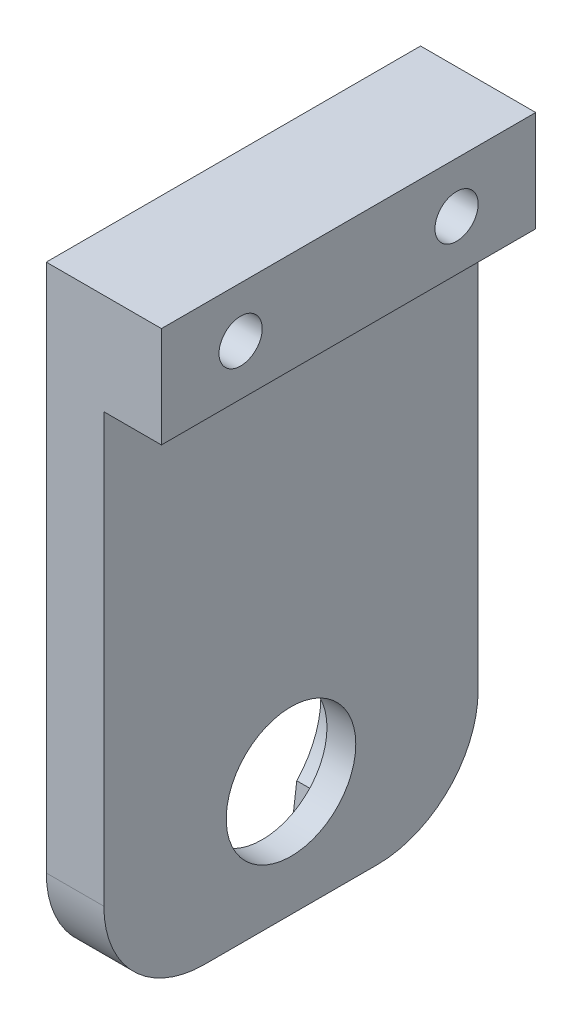
ISO-10303-21;
HEADER;
FILE_DESCRIPTION(('STEP AP214'),'2;1');
FILE_NAME('part.step','',(''),(''),'','','');
FILE_SCHEMA(('AUTOMOTIVE_DESIGN { 1 0 10303 214 1 1 1 1 }'));
ENDSEC;
DATA;
#1=APPLICATION_CONTEXT('core data for automotive mechanical design processes');
#2=APPLICATION_PROTOCOL_DEFINITION('international standard','automotive_design',2000,#1);
#3=PRODUCT_CONTEXT('',#1,'mechanical');
#4=PRODUCT('Part','Part','',(#3));
#5=PRODUCT_RELATED_PRODUCT_CATEGORY('part','',(#4));
#6=PRODUCT_DEFINITION_FORMATION('','',#4);
#7=PRODUCT_DEFINITION_CONTEXT('part definition',#1,'design');
#8=PRODUCT_DEFINITION('design','',#6,#7);
#9=PRODUCT_DEFINITION_SHAPE('','',#8);
#10=(LENGTH_UNIT() NAMED_UNIT(*) SI_UNIT(.MILLI.,.METRE.));
#11=(NAMED_UNIT(*) PLANE_ANGLE_UNIT() SI_UNIT($,.RADIAN.));
#12=(NAMED_UNIT(*) SI_UNIT($,.STERADIAN.) SOLID_ANGLE_UNIT());
#13=UNCERTAINTY_MEASURE_WITH_UNIT(LENGTH_MEASURE(1.E-05),#10,'distance_accuracy_value','');
#14=(GEOMETRIC_REPRESENTATION_CONTEXT(3) GLOBAL_UNCERTAINTY_ASSIGNED_CONTEXT((#13)) GLOBAL_UNIT_ASSIGNED_CONTEXT((#10,
#11,#12)) REPRESENTATION_CONTEXT('',''));
#15=CARTESIAN_POINT('',(0.,0.,0.));
#16=DIRECTION('',(0.,0.,1.));
#17=DIRECTION('',(1.,0.,0.));
#18=AXIS2_PLACEMENT_3D('',#15,#16,#17);
#19=CARTESIAN_POINT('',(0.,26.25,-13.));
#20=DIRECTION('',(0.,1.,0.));
#21=DIRECTION('',(0.,0.,1.));
#22=AXIS2_PLACEMENT_3D('',#19,#20,#21);
#23=PLANE('',#22);
#24=DIRECTION('',(0.,0.,1.));
#25=VECTOR('',#24,1.);
#26=CARTESIAN_POINT('',(8.,26.25,-13.));
#27=LINE('',#26,#25);
#28=CARTESIAN_POINT('',(8.,26.25,-13.));
#29=VERTEX_POINT('',#28);
#30=CARTESIAN_POINT('',(8.,26.25,13.));
#31=VERTEX_POINT('',#30);
#32=EDGE_CURVE('E226',#29,#31,#27,.T.);
#33=ORIENTED_EDGE('',*,*,#32,.F.);
#34=DIRECTION('',(1.,0.,0.));
#35=VECTOR('',#34,1.);
#36=CARTESIAN_POINT('',(0.,26.25,-13.));
#37=LINE('',#36,#35);
#38=CARTESIAN_POINT('',(0.,26.25,-13.));
#39=VERTEX_POINT('',#38);
#40=EDGE_CURVE('E259',#39,#29,#37,.T.);
#41=ORIENTED_EDGE('',*,*,#40,.F.);
#42=DIRECTION('',(0.,0.,1.));
#43=VECTOR('',#42,1.);
#44=CARTESIAN_POINT('',(0.,26.25,-13.));
#45=LINE('',#44,#43);
#46=CARTESIAN_POINT('',(0.,26.25,13.));
#47=VERTEX_POINT('',#46);
#48=EDGE_CURVE('E241',#39,#47,#45,.T.);
#49=ORIENTED_EDGE('',*,*,#48,.T.);
#50=DIRECTION('',(1.,0.,0.));
#51=VECTOR('',#50,1.);
#52=CARTESIAN_POINT('',(0.,26.25,13.));
#53=LINE('',#52,#51);
#54=EDGE_CURVE('E252',#47,#31,#53,.T.);
#55=ORIENTED_EDGE('',*,*,#54,.T.);
#56=EDGE_LOOP('',(#33,#41,#49,#55));
#57=FACE_BOUND('',#56,.T.);
#58=ADVANCED_FACE('F32',(#57),#23,.T.);
#59=CARTESIAN_POINT('',(0.,-17.5,-13.));
#60=DIRECTION('',(0.,0.,-1.));
#61=DIRECTION('',(-1.,0.,0.));
#62=AXIS2_PLACEMENT_3D('',#59,#60,#61);
#63=PLANE('',#62);
#64=DIRECTION('',(0.,-1.,0.));
#65=VECTOR('',#64,1.);
#66=CARTESIAN_POINT('',(4.,19.25,-13.));
#67=LINE('',#66,#65);
#68=CARTESIAN_POINT('',(4.,19.25,-13.));
#69=VERTEX_POINT('',#68);
#70=CARTESIAN_POINT('',(4.,-10.5,-13.));
#71=VERTEX_POINT('',#70);
#72=EDGE_CURVE('E158',#69,#71,#67,.T.);
#73=ORIENTED_EDGE('',*,*,#72,.T.);
#74=DIRECTION('',(1.,0.,0.));
#75=VECTOR('',#74,1.);
#76=CARTESIAN_POINT('',(0.,-10.5,-13.));
#77=LINE('',#76,#75);
#78=CARTESIAN_POINT('',(0.,-10.5,-13.));
#79=VERTEX_POINT('',#78);
#80=EDGE_CURVE('E11',#71,#79,#77,.F.);
#81=ORIENTED_EDGE('',*,*,#80,.T.);
#82=DIRECTION('',(0.,1.,0.));
#83=VECTOR('',#82,1.);
#84=CARTESIAN_POINT('',(0.,-17.5,-13.));
#85=LINE('',#84,#83);
#86=EDGE_CURVE('E250',#79,#39,#85,.T.);
#87=ORIENTED_EDGE('',*,*,#86,.T.);
#88=ORIENTED_EDGE('',*,*,#40,.T.);
#89=DIRECTION('',(0.,1.,0.));
#90=VECTOR('',#89,1.);
#91=CARTESIAN_POINT('',(8.,-17.5,-13.));
#92=LINE('',#91,#90);
#93=CARTESIAN_POINT('',(8.,19.25,-13.));
#94=VERTEX_POINT('',#93);
#95=EDGE_CURVE('E166',#94,#29,#92,.T.);
#96=ORIENTED_EDGE('',*,*,#95,.F.);
#97=DIRECTION('',(-1.,0.,0.));
#98=VECTOR('',#97,1.);
#99=CARTESIAN_POINT('',(8.,19.25,-13.));
#100=LINE('',#99,#98);
#101=EDGE_CURVE('E148',#94,#69,#100,.T.);
#102=ORIENTED_EDGE('',*,*,#101,.T.);
#103=EDGE_LOOP('',(#73,#81,#87,#88,#96,#102));
#104=FACE_BOUND('',#103,.T.);
#105=ADVANCED_FACE('F164',(#104),#63,.T.);
#106=CARTESIAN_POINT('',(0.,-17.5,13.));
#107=DIRECTION('',(0.,-1.,0.));
#108=DIRECTION('',(0.,0.,-1.));
#109=AXIS2_PLACEMENT_3D('',#106,#107,#108);
#110=PLANE('',#109);
#111=DIRECTION('',(0.,0.,1.));
#112=VECTOR('',#111,1.);
#113=CARTESIAN_POINT('',(4.,-17.5,-13.));
#114=LINE('',#113,#112);
#115=CARTESIAN_POINT('',(4.,-17.5,-6.));
#116=VERTEX_POINT('',#115);
#117=CARTESIAN_POINT('',(4.,-17.5,5.99999999999999));
#118=VERTEX_POINT('',#117);
#119=EDGE_CURVE('E155',#116,#118,#114,.T.);
#120=ORIENTED_EDGE('',*,*,#119,.T.);
#121=DIRECTION('',(1.,0.,0.));
#122=VECTOR('',#121,1.);
#123=CARTESIAN_POINT('',(0.,-17.5,6.));
#124=LINE('',#123,#122);
#125=CARTESIAN_POINT('',(0.,-17.5,6.));
#126=VERTEX_POINT('',#125);
#127=EDGE_CURVE('E271',#118,#126,#124,.F.);
#128=ORIENTED_EDGE('',*,*,#127,.T.);
#129=DIRECTION('',(0.,0.,-1.));
#130=VECTOR('',#129,1.);
#131=CARTESIAN_POINT('',(0.,-17.5,13.));
#132=LINE('',#131,#130);
#133=CARTESIAN_POINT('',(0.,-17.5,3.90123819584801));
#134=VERTEX_POINT('',#133);
#135=EDGE_CURVE('E248',#126,#134,#132,.T.);
#136=ORIENTED_EDGE('',*,*,#135,.T.);
#137=DIRECTION('',(-1.,0.,0.));
#138=VECTOR('',#137,1.);
#139=CARTESIAN_POINT('',(2.,-17.5,3.90123819584801));
#140=LINE('',#139,#138);
#141=CARTESIAN_POINT('',(2.,-17.5,3.90123819584801));
#142=VERTEX_POINT('',#141);
#143=EDGE_CURVE('E204',#142,#134,#140,.T.);
#144=ORIENTED_EDGE('',*,*,#143,.F.);
#145=DIRECTION('',(0.,0.,1.));
#146=VECTOR('',#145,1.);
#147=CARTESIAN_POINT('',(2.,-17.5,-3.90123819584801));
#148=LINE('',#147,#146);
#149=CARTESIAN_POINT('',(2.,-17.5,-3.90123819584801));
#150=VERTEX_POINT('',#149);
#151=EDGE_CURVE('E179',#150,#142,#148,.T.);
#152=ORIENTED_EDGE('',*,*,#151,.F.);
#153=DIRECTION('',(-1.,0.,0.));
#154=VECTOR('',#153,1.);
#155=CARTESIAN_POINT('',(2.,-17.5,-3.90123819584801));
#156=LINE('',#155,#154);
#157=CARTESIAN_POINT('',(0.,-17.5,-3.90123819584801));
#158=VERTEX_POINT('',#157);
#159=EDGE_CURVE('E223',#150,#158,#156,.T.);
#160=ORIENTED_EDGE('',*,*,#159,.T.);
#161=CARTESIAN_POINT('',(0.,-17.5,-5.99999999999999));
#162=VERTEX_POINT('',#161);
#163=EDGE_CURVE('E247',#158,#162,#132,.T.);
#164=ORIENTED_EDGE('',*,*,#163,.T.);
#165=DIRECTION('',(1.,0.,0.));
#166=VECTOR('',#165,1.);
#167=CARTESIAN_POINT('',(0.,-17.5,-6.));
#168=LINE('',#167,#166);
#169=EDGE_CURVE('E268',#162,#116,#168,.T.);
#170=ORIENTED_EDGE('',*,*,#169,.T.);
#171=EDGE_LOOP('',(#120,#128,#136,#144,#152,#160,#164,#170));
#172=FACE_BOUND('',#171,.T.);
#173=ADVANCED_FACE('F287',(#172),#110,.T.);
#174=CARTESIAN_POINT('',(0.,26.25,13.));
#175=DIRECTION('',(0.,0.,1.));
#176=DIRECTION('',(1.,0.,0.));
#177=AXIS2_PLACEMENT_3D('',#174,#175,#176);
#178=PLANE('',#177);
#179=DIRECTION('',(0.,-1.,0.));
#180=VECTOR('',#179,1.);
#181=CARTESIAN_POINT('',(0.,26.25,13.));
#182=LINE('',#181,#180);
#183=CARTESIAN_POINT('',(0.,-10.5,13.));
#184=VERTEX_POINT('',#183);
#185=EDGE_CURVE('E244',#47,#184,#182,.T.);
#186=ORIENTED_EDGE('',*,*,#185,.T.);
#187=DIRECTION('',(1.,0.,0.));
#188=VECTOR('',#187,1.);
#189=CARTESIAN_POINT('',(0.,-10.5,13.));
#190=LINE('',#189,#188);
#191=CARTESIAN_POINT('',(4.,-10.5,13.));
#192=VERTEX_POINT('',#191);
#193=EDGE_CURVE('E261',#184,#192,#190,.T.);
#194=ORIENTED_EDGE('',*,*,#193,.T.);
#195=DIRECTION('',(0.,-1.,0.));
#196=VECTOR('',#195,1.);
#197=CARTESIAN_POINT('',(4.,19.25,13.));
#198=LINE('',#197,#196);
#199=CARTESIAN_POINT('',(4.,19.25,13.));
#200=VERTEX_POINT('',#199);
#201=EDGE_CURVE('E167',#200,#192,#198,.T.);
#202=ORIENTED_EDGE('',*,*,#201,.F.);
#203=DIRECTION('',(-1.,0.,0.));
#204=VECTOR('',#203,1.);
#205=CARTESIAN_POINT('',(8.,19.25,13.));
#206=LINE('',#205,#204);
#207=CARTESIAN_POINT('',(8.,19.25,13.));
#208=VERTEX_POINT('',#207);
#209=EDGE_CURVE('E151',#208,#200,#206,.T.);
#210=ORIENTED_EDGE('',*,*,#209,.F.);
#211=DIRECTION('',(0.,-1.,0.));
#212=VECTOR('',#211,1.);
#213=CARTESIAN_POINT('',(8.,26.25,13.));
#214=LINE('',#213,#212);
#215=EDGE_CURVE('E255',#31,#208,#214,.T.);
#216=ORIENTED_EDGE('',*,*,#215,.F.);
#217=ORIENTED_EDGE('',*,*,#54,.F.);
#218=EDGE_LOOP('',(#186,#194,#202,#210,#216,#217));
#219=FACE_BOUND('',#218,.T.);
#220=ADVANCED_FACE('F283',(#219),#178,.T.);
#221=CARTESIAN_POINT('',(0.,0.,0.));
#222=DIRECTION('',(1.,0.,0.));
#223=DIRECTION('',(0.,0.,-1.));
#224=AXIS2_PLACEMENT_3D('',#221,#222,#223);
#225=PLANE('',#224);
#226=CARTESIAN_POINT('',(0.,22.75,-7.5));
#227=DIRECTION('',(-1.,0.,0.));
#228=DIRECTION('',(0.,0.,1.));
#229=AXIS2_PLACEMENT_3D('',#226,#227,#228);
#230=CIRCLE('',#229,2.75);
#231=CARTESIAN_POINT('',(0.,22.75,-4.75));
#232=VERTEX_POINT('',#231);
#233=EDGE_CURVE('E388',#232,#232,#230,.T.);
#234=ORIENTED_EDGE('',*,*,#233,.F.);
#235=EDGE_LOOP('',(#234));
#236=FACE_BOUND('',#235,.T.);
#237=CARTESIAN_POINT('',(0.,22.75,7.5));
#238=DIRECTION('',(-1.,0.,0.));
#239=DIRECTION('',(0.,0.,1.));
#240=AXIS2_PLACEMENT_3D('',#237,#238,#239);
#241=CIRCLE('',#240,2.75);
#242=CARTESIAN_POINT('',(0.,22.75,10.25));
#243=VERTEX_POINT('',#242);
#244=EDGE_CURVE('E402',#243,#243,#241,.T.);
#245=ORIENTED_EDGE('',*,*,#244,.F.);
#246=EDGE_LOOP('',(#245));
#247=FACE_BOUND('',#246,.T.);
#248=ORIENTED_EDGE('',*,*,#135,.F.);
#249=CARTESIAN_POINT('',(0.,-10.5,6.));
#250=DIRECTION('',(1.,0.,0.));
#251=DIRECTION('',(0.,0.,-1.));
#252=AXIS2_PLACEMENT_3D('',#249,#250,#251);
#253=CIRCLE('',#252,7.);
#254=EDGE_CURVE('E40',#126,#184,#253,.F.);
#255=ORIENTED_EDGE('',*,*,#254,.T.);
#256=ORIENTED_EDGE('',*,*,#185,.F.);
#257=ORIENTED_EDGE('',*,*,#48,.F.);
#258=ORIENTED_EDGE('',*,*,#86,.F.);
#259=CARTESIAN_POINT('',(0.,-10.5,-6.));
#260=DIRECTION('',(1.,0.,0.));
#261=DIRECTION('',(0.,0.,-1.));
#262=AXIS2_PLACEMENT_3D('',#259,#260,#261);
#263=CIRCLE('',#262,7.);
#264=EDGE_CURVE('E52',#79,#162,#263,.F.);
#265=ORIENTED_EDGE('',*,*,#264,.T.);
#266=ORIENTED_EDGE('',*,*,#163,.F.);
#267=DIRECTION('',(0.,-0.991702506662188,0.128554028641394));
#268=VECTOR('',#267,1.);
#269=CARTESIAN_POINT('',(0.,-13.6524089393989,-4.4));
#270=LINE('',#269,#268);
#271=CARTESIAN_POINT('',(0.,-13.6524089393989,-4.4));
#272=VERTEX_POINT('',#271);
#273=EDGE_CURVE('E183',#272,#158,#270,.T.);
#274=ORIENTED_EDGE('',*,*,#273,.F.);
#275=CARTESIAN_POINT('',(0.,-9.43136514149753,0.0727272727272799));
#276=DIRECTION('',(-1.,0.,0.));
#277=DIRECTION('',(0.,0.,1.));
#278=AXIS2_PLACEMENT_3D('',#275,#276,#277);
#279=CIRCLE('',#278,6.15);
#280=CARTESIAN_POINT('',(0.,-5.21032134359616,-4.39999999999999));
#281=VERTEX_POINT('',#280);
#282=EDGE_CURVE('E219',#281,#272,#279,.T.);
#283=ORIENTED_EDGE('',*,*,#282,.F.);
#284=DIRECTION('',(0.,-0.991702506662188,-0.128554028641395));
#285=VECTOR('',#284,1.);
#286=CARTESIAN_POINT('',(0.,8.28967865640385,-2.64999999999999));
#287=LINE('',#286,#285);
#288=CARTESIAN_POINT('',(0.,8.28967865640385,-2.64999999999999));
#289=VERTEX_POINT('',#288);
#290=EDGE_CURVE('E216',#289,#281,#287,.T.);
#291=ORIENTED_EDGE('',*,*,#290,.F.);
#292=CARTESIAN_POINT('',(0.,8.28967865640385,0.0727272727272812));
#293=DIRECTION('',(-1.,0.,0.));
#294=DIRECTION('',(0.,0.,1.));
#295=AXIS2_PLACEMENT_3D('',#292,#293,#294);
#296=CIRCLE('',#295,2.72272727272727);
#297=CARTESIAN_POINT('',(0.,8.28967865640384,2.79545454545455));
#298=VERTEX_POINT('',#297);
#299=EDGE_CURVE('E213',#298,#289,#296,.T.);
#300=ORIENTED_EDGE('',*,*,#299,.F.);
#301=DIRECTION('',(0.,0.991702506662188,-0.128554028641395));
#302=VECTOR('',#301,1.);
#303=CARTESIAN_POINT('',(0.,-5.21032134359616,4.54545454545455));
#304=LINE('',#303,#302);
#305=CARTESIAN_POINT('',(0.,-5.21032134359616,4.54545454545455));
#306=VERTEX_POINT('',#305);
#307=EDGE_CURVE('E210',#306,#298,#304,.T.);
#308=ORIENTED_EDGE('',*,*,#307,.F.);
#309=CARTESIAN_POINT('',(0.,-9.43136514149753,0.0727272727272799));
#310=DIRECTION('',(-1.,0.,0.));
#311=DIRECTION('',(0.,0.,1.));
#312=AXIS2_PLACEMENT_3D('',#309,#310,#311);
#313=CIRCLE('',#312,6.15);
#314=CARTESIAN_POINT('',(0.,-13.6524089393989,4.54545454545455));
#315=VERTEX_POINT('',#314);
#316=EDGE_CURVE('E207',#315,#306,#313,.T.);
#317=ORIENTED_EDGE('',*,*,#316,.F.);
#318=DIRECTION('',(0.,0.986270975501593,0.165134983825767));
#319=VECTOR('',#318,1.);
#320=CARTESIAN_POINT('',(0.,-17.5,3.90123819584801));
#321=LINE('',#320,#319);
#322=EDGE_CURVE('E176',#134,#315,#321,.T.);
#323=ORIENTED_EDGE('',*,*,#322,.F.);
#324=EDGE_LOOP('',(#248,#255,#256,#257,#258,#265,#266,#274,#283,#291,#300,#308,#317,#323));
#325=FACE_BOUND('',#324,.T.);
#326=ADVANCED_FACE('F276',(#236,#247,#325),#225,.F.);
#327=CARTESIAN_POINT('',(8.,0.,0.));
#328=DIRECTION('',(1.,0.,0.));
#329=DIRECTION('',(0.,0.,-1.));
#330=AXIS2_PLACEMENT_3D('',#327,#328,#329);
#331=PLANE('',#330);
#332=CARTESIAN_POINT('',(8.00000000000001,22.75,-7.5));
#333=DIRECTION('',(-1.,0.,0.));
#334=DIRECTION('',(0.,0.,1.));
#335=AXIS2_PLACEMENT_3D('',#332,#333,#334);
#336=CIRCLE('',#335,1.50000000000001);
#337=CARTESIAN_POINT('',(8.00000000000001,22.75,-5.99999999999999));
#338=VERTEX_POINT('',#337);
#339=EDGE_CURVE('E399',#338,#338,#336,.T.);
#340=ORIENTED_EDGE('',*,*,#339,.T.);
#341=EDGE_LOOP('',(#340));
#342=FACE_BOUND('',#341,.T.);
#343=CARTESIAN_POINT('',(8.00000000000001,22.75,7.5));
#344=DIRECTION('',(-1.,0.,0.));
#345=DIRECTION('',(0.,0.,1.));
#346=AXIS2_PLACEMENT_3D('',#343,#344,#345);
#347=CIRCLE('',#346,1.50000000000001);
#348=CARTESIAN_POINT('',(8.00000000000001,22.75,9.00000000000001));
#349=VERTEX_POINT('',#348);
#350=EDGE_CURVE('E171',#349,#349,#347,.T.);
#351=ORIENTED_EDGE('',*,*,#350,.T.);
#352=EDGE_LOOP('',(#351));
#353=FACE_BOUND('',#352,.T.);
#354=DIRECTION('',(0.,0.,1.));
#355=VECTOR('',#354,1.);
#356=CARTESIAN_POINT('',(8.,19.25,-13.));
#357=LINE('',#356,#355);
#358=EDGE_CURVE('E156',#94,#208,#357,.T.);
#359=ORIENTED_EDGE('',*,*,#358,.F.);
#360=ORIENTED_EDGE('',*,*,#95,.T.);
#361=ORIENTED_EDGE('',*,*,#32,.T.);
#362=ORIENTED_EDGE('',*,*,#215,.T.);
#363=EDGE_LOOP('',(#359,#360,#361,#362));
#364=FACE_BOUND('',#363,.T.);
#365=ADVANCED_FACE('F308',(#342,#353,#364),#331,.T.);
#366=CARTESIAN_POINT('',(2.,-13.6524089393989,-4.4));
#367=DIRECTION('',(0.,-0.128554028641394,-0.991702506662189));
#368=DIRECTION('',(0.,0.991702506662189,-0.128554028641394));
#369=AXIS2_PLACEMENT_3D('',#366,#367,#368);
#370=PLANE('',#369);
#371=ORIENTED_EDGE('',*,*,#273,.T.);
#372=ORIENTED_EDGE('',*,*,#159,.F.);
#373=DIRECTION('',(0.,-0.991702506662188,0.128554028641394));
#374=VECTOR('',#373,1.);
#375=CARTESIAN_POINT('',(2.,-13.6524089393989,-4.4));
#376=LINE('',#375,#374);
#377=CARTESIAN_POINT('',(2.,-13.6524089393989,-4.4));
#378=VERTEX_POINT('',#377);
#379=EDGE_CURVE('E201',#378,#150,#376,.T.);
#380=ORIENTED_EDGE('',*,*,#379,.F.);
#381=DIRECTION('',(-1.,0.,0.));
#382=VECTOR('',#381,1.);
#383=CARTESIAN_POINT('',(2.,-13.6524089393989,-4.4));
#384=LINE('',#383,#382);
#385=EDGE_CURVE('E227',#378,#272,#384,.T.);
#386=ORIENTED_EDGE('',*,*,#385,.T.);
#387=EDGE_LOOP('',(#371,#372,#380,#386));
#388=FACE_BOUND('',#387,.T.);
#389=ADVANCED_FACE('F311',(#388),#370,.F.);
#390=CARTESIAN_POINT('',(2.,-9.43136514149753,0.0727272727272799));
#391=DIRECTION('',(-1.,0.,0.));
#392=DIRECTION('',(0.,0.,1.));
#393=AXIS2_PLACEMENT_3D('',#390,#391,#392);
#394=CYLINDRICAL_SURFACE('',#393,6.15);
#395=ORIENTED_EDGE('',*,*,#282,.T.);
#396=ORIENTED_EDGE('',*,*,#385,.F.);
#397=CARTESIAN_POINT('',(2.,-9.43136514149753,0.0727272727272799));
#398=DIRECTION('',(-1.,0.,0.));
#399=DIRECTION('',(0.,0.,1.));
#400=AXIS2_PLACEMENT_3D('',#397,#398,#399);
#401=CIRCLE('',#400,6.15);
#402=CARTESIAN_POINT('',(2.,-5.21032134359616,-4.39999999999999));
#403=VERTEX_POINT('',#402);
#404=EDGE_CURVE('E198',#403,#378,#401,.T.);
#405=ORIENTED_EDGE('',*,*,#404,.F.);
#406=DIRECTION('',(-1.,0.,0.));
#407=VECTOR('',#406,1.);
#408=CARTESIAN_POINT('',(2.,-5.21032134359616,-4.39999999999999));
#409=LINE('',#408,#407);
#410=EDGE_CURVE('E229',#403,#281,#409,.T.);
#411=ORIENTED_EDGE('',*,*,#410,.T.);
#412=EDGE_LOOP('',(#395,#396,#405,#411));
#413=FACE_BOUND('',#412,.T.);
#414=ADVANCED_FACE('F336',(#413),#394,.F.);
#415=CARTESIAN_POINT('',(2.,8.28967865640385,-2.64999999999999));
#416=DIRECTION('',(0.,0.128554028641395,-0.991702506662188));
#417=DIRECTION('',(0.,0.991702506662188,0.128554028641395));
#418=AXIS2_PLACEMENT_3D('',#415,#416,#417);
#419=PLANE('',#418);
#420=ORIENTED_EDGE('',*,*,#290,.T.);
#421=ORIENTED_EDGE('',*,*,#410,.F.);
#422=DIRECTION('',(0.,-0.991702506662188,-0.128554028641395));
#423=VECTOR('',#422,1.);
#424=CARTESIAN_POINT('',(2.,8.28967865640385,-2.64999999999999));
#425=LINE('',#424,#423);
#426=CARTESIAN_POINT('',(2.,8.28967865640385,-2.64999999999999));
#427=VERTEX_POINT('',#426);
#428=EDGE_CURVE('E195',#427,#403,#425,.T.);
#429=ORIENTED_EDGE('',*,*,#428,.F.);
#430=DIRECTION('',(-1.,0.,0.));
#431=VECTOR('',#430,1.);
#432=CARTESIAN_POINT('',(2.,8.28967865640385,-2.64999999999999));
#433=LINE('',#432,#431);
#434=EDGE_CURVE('E231',#427,#289,#433,.T.);
#435=ORIENTED_EDGE('',*,*,#434,.T.);
#436=EDGE_LOOP('',(#420,#421,#429,#435));
#437=FACE_BOUND('',#436,.T.);
#438=ADVANCED_FACE('F332',(#437),#419,.F.);
#439=CARTESIAN_POINT('',(2.,8.28967865640385,0.0727272727272812));
#440=DIRECTION('',(-1.,0.,0.));
#441=DIRECTION('',(0.,0.,1.));
#442=AXIS2_PLACEMENT_3D('',#439,#440,#441);
#443=CYLINDRICAL_SURFACE('',#442,2.72272727272727);
#444=ORIENTED_EDGE('',*,*,#299,.T.);
#445=ORIENTED_EDGE('',*,*,#434,.F.);
#446=CARTESIAN_POINT('',(2.,8.28967865640385,0.0727272727272812));
#447=DIRECTION('',(-1.,0.,0.));
#448=DIRECTION('',(0.,0.,1.));
#449=AXIS2_PLACEMENT_3D('',#446,#447,#448);
#450=CIRCLE('',#449,2.72272727272727);
#451=CARTESIAN_POINT('',(2.,8.28967865640384,2.79545454545455));
#452=VERTEX_POINT('',#451);
#453=EDGE_CURVE('E192',#452,#427,#450,.T.);
#454=ORIENTED_EDGE('',*,*,#453,.F.);
#455=DIRECTION('',(-1.,0.,0.));
#456=VECTOR('',#455,1.);
#457=CARTESIAN_POINT('',(2.,8.28967865640384,2.79545454545455));
#458=LINE('',#457,#456);
#459=EDGE_CURVE('E233',#452,#298,#458,.T.);
#460=ORIENTED_EDGE('',*,*,#459,.T.);
#461=EDGE_LOOP('',(#444,#445,#454,#460));
#462=FACE_BOUND('',#461,.T.);
#463=ADVANCED_FACE('F328',(#462),#443,.F.);
#464=CARTESIAN_POINT('',(2.,-5.21032134359616,4.54545454545455));
#465=DIRECTION('',(0.,0.128554028641395,0.991702506662188));
#466=DIRECTION('',(0.,-0.991702506662188,0.128554028641395));
#467=AXIS2_PLACEMENT_3D('',#464,#465,#466);
#468=PLANE('',#467);
#469=ORIENTED_EDGE('',*,*,#307,.T.);
#470=ORIENTED_EDGE('',*,*,#459,.F.);
#471=DIRECTION('',(0.,0.991702506662188,-0.128554028641395));
#472=VECTOR('',#471,1.);
#473=CARTESIAN_POINT('',(2.,-5.21032134359616,4.54545454545455));
#474=LINE('',#473,#472);
#475=CARTESIAN_POINT('',(2.,-5.21032134359616,4.54545454545455));
#476=VERTEX_POINT('',#475);
#477=EDGE_CURVE('E189',#476,#452,#474,.T.);
#478=ORIENTED_EDGE('',*,*,#477,.F.);
#479=DIRECTION('',(-1.,0.,0.));
#480=VECTOR('',#479,1.);
#481=CARTESIAN_POINT('',(2.,-5.21032134359616,4.54545454545455));
#482=LINE('',#481,#480);
#483=EDGE_CURVE('E235',#476,#306,#482,.T.);
#484=ORIENTED_EDGE('',*,*,#483,.T.);
#485=EDGE_LOOP('',(#469,#470,#478,#484));
#486=FACE_BOUND('',#485,.T.);
#487=ADVANCED_FACE('F324',(#486),#468,.F.);
#488=CARTESIAN_POINT('',(2.,-9.43136514149753,0.0727272727272799));
#489=DIRECTION('',(-1.,0.,0.));
#490=DIRECTION('',(0.,0.,1.));
#491=AXIS2_PLACEMENT_3D('',#488,#489,#490);
#492=CYLINDRICAL_SURFACE('',#491,6.15);
#493=ORIENTED_EDGE('',*,*,#316,.T.);
#494=ORIENTED_EDGE('',*,*,#483,.F.);
#495=CARTESIAN_POINT('',(2.,-9.43136514149753,0.0727272727272799));
#496=DIRECTION('',(-1.,0.,0.));
#497=DIRECTION('',(0.,0.,1.));
#498=AXIS2_PLACEMENT_3D('',#495,#496,#497);
#499=CIRCLE('',#498,6.15);
#500=CARTESIAN_POINT('',(2.,-13.6524089393989,4.54545454545455));
#501=VERTEX_POINT('',#500);
#502=EDGE_CURVE('E186',#501,#476,#499,.T.);
#503=ORIENTED_EDGE('',*,*,#502,.F.);
#504=DIRECTION('',(-1.,0.,0.));
#505=VECTOR('',#504,1.);
#506=CARTESIAN_POINT('',(2.,-13.6524089393989,4.54545454545455));
#507=LINE('',#506,#505);
#508=EDGE_CURVE('E237',#501,#315,#507,.T.);
#509=ORIENTED_EDGE('',*,*,#508,.T.);
#510=EDGE_LOOP('',(#493,#494,#503,#509));
#511=FACE_BOUND('',#510,.T.);
#512=ADVANCED_FACE('F320',(#511),#492,.F.);
#513=CARTESIAN_POINT('',(2.,-17.5,3.90123819584801));
#514=DIRECTION('',(0.,-0.165134983825767,0.986270975501593));
#515=DIRECTION('',(0.,-0.986270975501593,-0.165134983825767));
#516=AXIS2_PLACEMENT_3D('',#513,#514,#515);
#517=PLANE('',#516);
#518=ORIENTED_EDGE('',*,*,#322,.T.);
#519=ORIENTED_EDGE('',*,*,#508,.F.);
#520=DIRECTION('',(0.,0.986270975501593,0.165134983825767));
#521=VECTOR('',#520,1.);
#522=CARTESIAN_POINT('',(2.,-17.5,3.90123819584801));
#523=LINE('',#522,#521);
#524=EDGE_CURVE('E182',#142,#501,#523,.T.);
#525=ORIENTED_EDGE('',*,*,#524,.F.);
#526=ORIENTED_EDGE('',*,*,#143,.T.);
#527=EDGE_LOOP('',(#518,#519,#525,#526));
#528=FACE_BOUND('',#527,.T.);
#529=ADVANCED_FACE('F316',(#528),#517,.F.);
#530=CARTESIAN_POINT('',(2.,-9.43136514149753,0.0727272727272799));
#531=DIRECTION('',(-1.,0.,0.));
#532=DIRECTION('',(0.,0.,1.));
#533=AXIS2_PLACEMENT_3D('',#530,#531,#532);
#534=PLANE('',#533);
#535=CARTESIAN_POINT('',(2.,-9.5,0.));
#536=DIRECTION('',(-1.,0.,0.));
#537=DIRECTION('',(0.,0.,1.));
#538=AXIS2_PLACEMENT_3D('',#535,#536,#537);
#539=CIRCLE('',#538,4.49999999999999);
#540=CARTESIAN_POINT('',(2.,-9.5,4.49999999999999));
#541=VERTEX_POINT('',#540);
#542=EDGE_CURVE('E383',#541,#541,#539,.T.);
#543=ORIENTED_EDGE('',*,*,#542,.F.);
#544=EDGE_LOOP('',(#543));
#545=FACE_BOUND('',#544,.T.);
#546=ORIENTED_EDGE('',*,*,#151,.T.);
#547=ORIENTED_EDGE('',*,*,#524,.T.);
#548=ORIENTED_EDGE('',*,*,#502,.T.);
#549=ORIENTED_EDGE('',*,*,#477,.T.);
#550=ORIENTED_EDGE('',*,*,#453,.T.);
#551=ORIENTED_EDGE('',*,*,#428,.T.);
#552=ORIENTED_EDGE('',*,*,#404,.T.);
#553=ORIENTED_EDGE('',*,*,#379,.T.);
#554=EDGE_LOOP('',(#546,#547,#548,#549,#550,#551,#552,#553));
#555=FACE_BOUND('',#554,.T.);
#556=ADVANCED_FACE('F319',(#545,#555),#534,.T.);
#557=CARTESIAN_POINT('',(4.,19.25,-13.));
#558=DIRECTION('',(-1.,0.,0.));
#559=DIRECTION('',(0.,-1.,0.));
#560=AXIS2_PLACEMENT_3D('',#557,#558,#559);
#561=PLANE('',#560);
#562=CARTESIAN_POINT('',(4.,-9.5,0.));
#563=DIRECTION('',(1.,0.,0.));
#564=DIRECTION('',(0.,0.,-1.));
#565=AXIS2_PLACEMENT_3D('',#562,#563,#564);
#566=CIRCLE('',#565,4.49999999999999);
#567=CARTESIAN_POINT('',(4.,-9.5,-4.49999999999999));
#568=VERTEX_POINT('',#567);
#569=EDGE_CURVE('E386',#568,#568,#566,.T.);
#570=ORIENTED_EDGE('',*,*,#569,.F.);
#571=EDGE_LOOP('',(#570));
#572=FACE_BOUND('',#571,.T.);
#573=ORIENTED_EDGE('',*,*,#201,.T.);
#574=CARTESIAN_POINT('',(4.,-10.5,6.));
#575=DIRECTION('',(-1.,0.,0.));
#576=DIRECTION('',(0.,-1.,0.));
#577=AXIS2_PLACEMENT_3D('',#574,#575,#576);
#578=CIRCLE('',#577,7.);
#579=EDGE_CURVE('E266',#192,#118,#578,.F.);
#580=ORIENTED_EDGE('',*,*,#579,.T.);
#581=ORIENTED_EDGE('',*,*,#119,.F.);
#582=CARTESIAN_POINT('',(4.,-10.5,-6.));
#583=DIRECTION('',(-1.,0.,0.));
#584=DIRECTION('',(0.,-1.,0.));
#585=AXIS2_PLACEMENT_3D('',#582,#583,#584);
#586=CIRCLE('',#585,7.);
#587=EDGE_CURVE('E161',#116,#71,#586,.F.);
#588=ORIENTED_EDGE('',*,*,#587,.T.);
#589=ORIENTED_EDGE('',*,*,#72,.F.);
#590=DIRECTION('',(0.,0.,1.));
#591=VECTOR('',#590,1.);
#592=CARTESIAN_POINT('',(4.,19.25,-13.));
#593=LINE('',#592,#591);
#594=EDGE_CURVE('E144',#69,#200,#593,.T.);
#595=ORIENTED_EDGE('',*,*,#594,.T.);
#596=EDGE_LOOP('',(#573,#580,#581,#588,#589,#595));
#597=FACE_BOUND('',#596,.T.);
#598=ADVANCED_FACE('F159',(#572,#597),#561,.F.);
#599=CARTESIAN_POINT('',(8.,19.25,-13.));
#600=DIRECTION('',(0.,1.,0.));
#601=DIRECTION('',(-1.,0.,0.));
#602=AXIS2_PLACEMENT_3D('',#599,#600,#601);
#603=PLANE('',#602);
#604=ORIENTED_EDGE('',*,*,#209,.T.);
#605=ORIENTED_EDGE('',*,*,#594,.F.);
#606=ORIENTED_EDGE('',*,*,#101,.F.);
#607=ORIENTED_EDGE('',*,*,#358,.T.);
#608=EDGE_LOOP('',(#604,#605,#606,#607));
#609=FACE_BOUND('',#608,.T.);
#610=ADVANCED_FACE('F146',(#609),#603,.F.);
#611=CARTESIAN_POINT('',(0.,22.75,7.5));
#612=DIRECTION('',(-1.,0.,0.));
#613=DIRECTION('',(0.,0.,1.));
#614=AXIS2_PLACEMENT_3D('',#611,#612,#613);
#615=CYLINDRICAL_SURFACE('',#614,1.50000000000001);
#616=ORIENTED_EDGE('',*,*,#350,.F.);
#617=EDGE_LOOP('',(#616));
#618=FACE_BOUND('',#617,.T.);
#619=CARTESIAN_POINT('',(1.,22.75,7.5));
#620=DIRECTION('',(-1.,0.,0.));
#621=DIRECTION('',(0.,0.,1.));
#622=AXIS2_PLACEMENT_3D('',#619,#620,#621);
#623=CIRCLE('',#622,1.50000000000001);
#624=CARTESIAN_POINT('',(1.,22.75,9.00000000000001));
#625=VERTEX_POINT('',#624);
#626=EDGE_CURVE('E407',#625,#625,#623,.T.);
#627=ORIENTED_EDGE('',*,*,#626,.T.);
#628=EDGE_LOOP('',(#627));
#629=FACE_BOUND('',#628,.T.);
#630=ADVANCED_FACE('F349',(#618,#629),#615,.F.);
#631=CARTESIAN_POINT('',(1.,24.25,7.5));
#632=DIRECTION('',(1.,0.,0.));
#633=DIRECTION('',(0.,0.,-1.));
#634=AXIS2_PLACEMENT_3D('',#631,#632,#633);
#635=PLANE('',#634);
#636=ORIENTED_EDGE('',*,*,#626,.F.);
#637=EDGE_LOOP('',(#636));
#638=FACE_BOUND('',#637,.T.);
#639=CARTESIAN_POINT('',(1.,22.75,7.5));
#640=DIRECTION('',(-1.,0.,0.));
#641=DIRECTION('',(0.,0.,1.));
#642=AXIS2_PLACEMENT_3D('',#639,#640,#641);
#643=CIRCLE('',#642,2.75);
#644=CARTESIAN_POINT('',(1.,22.75,10.25));
#645=VERTEX_POINT('',#644);
#646=EDGE_CURVE('E405',#645,#645,#643,.T.);
#647=ORIENTED_EDGE('',*,*,#646,.T.);
#648=EDGE_LOOP('',(#647));
#649=FACE_BOUND('',#648,.T.);
#650=ADVANCED_FACE('F355',(#638,#649),#635,.F.);
#651=CARTESIAN_POINT('',(0.,22.75,7.5));
#652=DIRECTION('',(-1.,0.,0.));
#653=DIRECTION('',(0.,0.,1.));
#654=AXIS2_PLACEMENT_3D('',#651,#652,#653);
#655=CYLINDRICAL_SURFACE('',#654,2.75);
#656=ORIENTED_EDGE('',*,*,#646,.F.);
#657=EDGE_LOOP('',(#656));
#658=FACE_BOUND('',#657,.T.);
#659=ORIENTED_EDGE('',*,*,#244,.T.);
#660=EDGE_LOOP('',(#659));
#661=FACE_BOUND('',#660,.T.);
#662=ADVANCED_FACE('F359',(#658,#661),#655,.F.);
#663=CARTESIAN_POINT('',(0.,22.75,-7.5));
#664=DIRECTION('',(-1.,0.,0.));
#665=DIRECTION('',(0.,0.,1.));
#666=AXIS2_PLACEMENT_3D('',#663,#664,#665);
#667=CYLINDRICAL_SURFACE('',#666,1.50000000000001);
#668=ORIENTED_EDGE('',*,*,#339,.F.);
#669=EDGE_LOOP('',(#668));
#670=FACE_BOUND('',#669,.T.);
#671=CARTESIAN_POINT('',(1.,22.75,-7.5));
#672=DIRECTION('',(-1.,0.,0.));
#673=DIRECTION('',(0.,0.,1.));
#674=AXIS2_PLACEMENT_3D('',#671,#672,#673);
#675=CIRCLE('',#674,1.50000000000001);
#676=CARTESIAN_POINT('',(1.,22.75,-5.99999999999999));
#677=VERTEX_POINT('',#676);
#678=EDGE_CURVE('E396',#677,#677,#675,.T.);
#679=ORIENTED_EDGE('',*,*,#678,.T.);
#680=EDGE_LOOP('',(#679));
#681=FACE_BOUND('',#680,.T.);
#682=ADVANCED_FACE('F363',(#670,#681),#667,.F.);
#683=CARTESIAN_POINT('',(1.,24.25,-7.5));
#684=DIRECTION('',(1.,0.,0.));
#685=DIRECTION('',(0.,0.,-1.));
#686=AXIS2_PLACEMENT_3D('',#683,#684,#685);
#687=PLANE('',#686);
#688=ORIENTED_EDGE('',*,*,#678,.F.);
#689=EDGE_LOOP('',(#688));
#690=FACE_BOUND('',#689,.T.);
#691=CARTESIAN_POINT('',(1.,22.75,-7.5));
#692=DIRECTION('',(-1.,0.,0.));
#693=DIRECTION('',(0.,0.,1.));
#694=AXIS2_PLACEMENT_3D('',#691,#692,#693);
#695=CIRCLE('',#694,2.75);
#696=CARTESIAN_POINT('',(1.,22.75,-4.75));
#697=VERTEX_POINT('',#696);
#698=EDGE_CURVE('E393',#697,#697,#695,.T.);
#699=ORIENTED_EDGE('',*,*,#698,.T.);
#700=EDGE_LOOP('',(#699));
#701=FACE_BOUND('',#700,.T.);
#702=ADVANCED_FACE('F367',(#690,#701),#687,.F.);
#703=CARTESIAN_POINT('',(0.,22.75,-7.5));
#704=DIRECTION('',(-1.,0.,0.));
#705=DIRECTION('',(0.,0.,1.));
#706=AXIS2_PLACEMENT_3D('',#703,#704,#705);
#707=CYLINDRICAL_SURFACE('',#706,2.75);
#708=ORIENTED_EDGE('',*,*,#698,.F.);
#709=EDGE_LOOP('',(#708));
#710=FACE_BOUND('',#709,.T.);
#711=ORIENTED_EDGE('',*,*,#233,.T.);
#712=EDGE_LOOP('',(#711));
#713=FACE_BOUND('',#712,.T.);
#714=ADVANCED_FACE('F371',(#710,#713),#707,.F.);
#715=CARTESIAN_POINT('',(4.,-9.5,0.));
#716=DIRECTION('',(1.,0.,0.));
#717=DIRECTION('',(0.,0.,-1.));
#718=AXIS2_PLACEMENT_3D('',#715,#716,#717);
#719=CYLINDRICAL_SURFACE('',#718,4.49999999999999);
#720=ORIENTED_EDGE('',*,*,#542,.T.);
#721=EDGE_LOOP('',(#720));
#722=FACE_BOUND('',#721,.T.);
#723=ORIENTED_EDGE('',*,*,#569,.T.);
#724=EDGE_LOOP('',(#723));
#725=FACE_BOUND('',#724,.T.);
#726=ADVANCED_FACE('F294',(#722,#725),#719,.F.);
#727=CARTESIAN_POINT('',(0.,-10.5,6.));
#728=DIRECTION('',(1.,0.,0.));
#729=DIRECTION('',(0.,0.,-1.));
#730=AXIS2_PLACEMENT_3D('',#727,#728,#729);
#731=CYLINDRICAL_SURFACE('',#730,7.);
#732=ORIENTED_EDGE('',*,*,#254,.F.);
#733=ORIENTED_EDGE('',*,*,#127,.F.);
#734=ORIENTED_EDGE('',*,*,#579,.F.);
#735=ORIENTED_EDGE('',*,*,#193,.F.);
#736=EDGE_LOOP('',(#732,#733,#734,#735));
#737=FACE_BOUND('',#736,.T.);
#738=ADVANCED_FACE('F285',(#737),#731,.T.);
#739=CARTESIAN_POINT('',(0.,-10.5,-6.));
#740=DIRECTION('',(1.,0.,0.));
#741=DIRECTION('',(0.,0.,-1.));
#742=AXIS2_PLACEMENT_3D('',#739,#740,#741);
#743=CYLINDRICAL_SURFACE('',#742,7.);
#744=ORIENTED_EDGE('',*,*,#264,.F.);
#745=ORIENTED_EDGE('',*,*,#80,.F.);
#746=ORIENTED_EDGE('',*,*,#587,.F.);
#747=ORIENTED_EDGE('',*,*,#169,.F.);
#748=EDGE_LOOP('',(#744,#745,#746,#747));
#749=FACE_BOUND('',#748,.T.);
#750=ADVANCED_FACE('F34',(#749),#743,.T.);
#751=CLOSED_SHELL('',(#58,#105,#173,#220,#326,#365,#389,#414,#438,#463,#487,#512,#529,#556,#598,
#610,#630,#650,#662,#682,#702,#714,#726,#738,#750));
#752=MANIFOLD_SOLID_BREP('B2',#751);
#753=ADVANCED_BREP_SHAPE_REPRESENTATION('',(#18,#752),#14);
#754=SHAPE_DEFINITION_REPRESENTATION(#9,#753);
ENDSEC;
END-ISO-10303-21;
